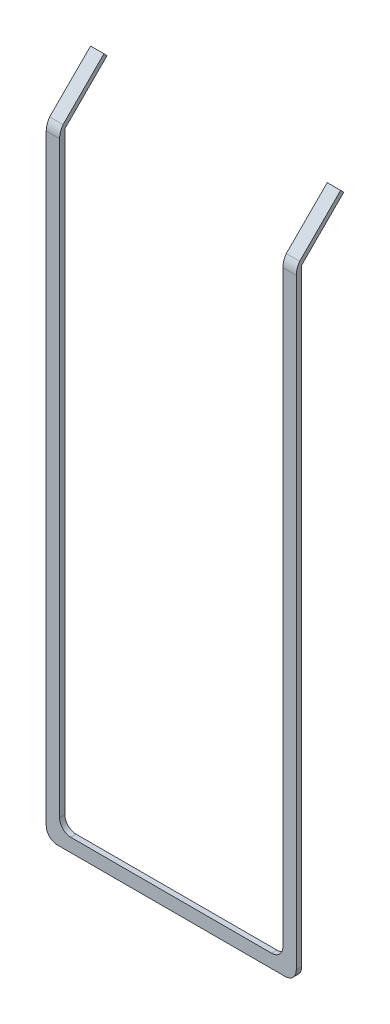
ISO-10303-21;
HEADER;
FILE_DESCRIPTION(('STEP AP214'),'2;1');
FILE_NAME('part.step','',(''),(''),'','','');
FILE_SCHEMA(('AUTOMOTIVE_DESIGN { 1 0 10303 214 1 1 1 1 }'));
ENDSEC;
DATA;
#1=APPLICATION_CONTEXT('core data for automotive mechanical design processes');
#2=APPLICATION_PROTOCOL_DEFINITION('international standard','automotive_design',2000,#1);
#3=PRODUCT_CONTEXT('',#1,'mechanical');
#4=PRODUCT('Part','Part','',(#3));
#5=PRODUCT_RELATED_PRODUCT_CATEGORY('part','',(#4));
#6=PRODUCT_DEFINITION_FORMATION('','',#4);
#7=PRODUCT_DEFINITION_CONTEXT('part definition',#1,'design');
#8=PRODUCT_DEFINITION('design','',#6,#7);
#9=PRODUCT_DEFINITION_SHAPE('','',#8);
#10=(LENGTH_UNIT() NAMED_UNIT(*) SI_UNIT(.MILLI.,.METRE.));
#11=(NAMED_UNIT(*) PLANE_ANGLE_UNIT() SI_UNIT($,.RADIAN.));
#12=(NAMED_UNIT(*) SI_UNIT($,.STERADIAN.) SOLID_ANGLE_UNIT());
#13=UNCERTAINTY_MEASURE_WITH_UNIT(LENGTH_MEASURE(1.E-05),#10,'distance_accuracy_value','');
#14=(GEOMETRIC_REPRESENTATION_CONTEXT(3) GLOBAL_UNCERTAINTY_ASSIGNED_CONTEXT((#13)) GLOBAL_UNIT_ASSIGNED_CONTEXT((#10,
#11,#12)) REPRESENTATION_CONTEXT('',''));
#15=CARTESIAN_POINT('',(0.,0.,0.));
#16=DIRECTION('',(0.,0.,1.));
#17=DIRECTION('',(1.,0.,0.));
#18=AXIS2_PLACEMENT_3D('',#15,#16,#17);
#19=CARTESIAN_POINT('',(-255.,-1375.,-52.5496011966032));
#20=DIRECTION('',(0.,0.,1.));
#21=DIRECTION('',(1.,0.,0.));
#22=AXIS2_PLACEMENT_3D('',#19,#20,#21);
#23=PLANE('',#22);
#24=DIRECTION('',(-1.,0.,0.));
#25=VECTOR('',#24,1.);
#26=CARTESIAN_POINT('',(-255.,-13.9779436067964,-52.5496011966032));
#27=LINE('',#26,#25);
#28=CARTESIAN_POINT('',(-250.,-13.9779436067966,-52.5496011966032));
#29=VERTEX_POINT('',#28);
#30=CARTESIAN_POINT('',(-280.,-13.9779436067966,-52.5496011966032));
#31=VERTEX_POINT('',#30);
#32=EDGE_CURVE('E194',#29,#31,#27,.T.);
#33=ORIENTED_EDGE('',*,*,#32,.F.);
#34=DIRECTION('',(0.,1.,0.));
#35=VECTOR('',#34,1.);
#36=CARTESIAN_POINT('',(-250.,-4.14213562373035,-52.5496011966032));
#37=LINE('',#36,#35);
#38=CARTESIAN_POINT('',(-250.,-1345.,-52.5496011966032));
#39=VERTEX_POINT('',#38);
#40=EDGE_CURVE('E168',#39,#29,#37,.T.);
#41=ORIENTED_EDGE('',*,*,#40,.F.);
#42=CARTESIAN_POINT('',(-225.,-1345.,-52.5496011966032));
#43=DIRECTION('',(0.,0.,-1.));
#44=DIRECTION('',(-1.,0.,0.));
#45=AXIS2_PLACEMENT_3D('',#42,#43,#44);
#46=CIRCLE('',#45,24.9999999999998);
#47=CARTESIAN_POINT('',(-225.,-1370.,-52.5496011966032));
#48=VERTEX_POINT('',#47);
#49=EDGE_CURVE('E259',#48,#39,#46,.T.);
#50=ORIENTED_EDGE('',*,*,#49,.F.);
#51=DIRECTION('',(-1.,0.,0.));
#52=VECTOR('',#51,1.);
#53=CARTESIAN_POINT('',(-225.,-1370.,-52.5496011966032));
#54=LINE('',#53,#52);
#55=CARTESIAN_POINT('',(225.,-1370.,-52.5496011966032));
#56=VERTEX_POINT('',#55);
#57=EDGE_CURVE('E257',#56,#48,#54,.T.);
#58=ORIENTED_EDGE('',*,*,#57,.F.);
#59=CARTESIAN_POINT('',(225.,-1345.,-52.5496011966032));
#60=DIRECTION('',(0.,0.,-1.));
#61=DIRECTION('',(1.,0.,0.));
#62=AXIS2_PLACEMENT_3D('',#59,#60,#61);
#63=CIRCLE('',#62,25.);
#64=CARTESIAN_POINT('',(250.,-1345.,-52.5496011966032));
#65=VERTEX_POINT('',#64);
#66=EDGE_CURVE('E255',#65,#56,#63,.T.);
#67=ORIENTED_EDGE('',*,*,#66,.F.);
#68=DIRECTION('',(0.,-1.,0.));
#69=VECTOR('',#68,1.);
#70=CARTESIAN_POINT('',(250.,-4.14213562373022,-52.5496011966032));
#71=LINE('',#70,#69);
#72=CARTESIAN_POINT('',(250.,-13.9779436067966,-52.5496011966033));
#73=VERTEX_POINT('',#72);
#74=EDGE_CURVE('E253',#73,#65,#71,.T.);
#75=ORIENTED_EDGE('',*,*,#74,.F.);
#76=DIRECTION('',(-1.,0.,0.));
#77=VECTOR('',#76,1.);
#78=CARTESIAN_POINT('',(-255.,-13.9779436067964,-52.5496011966032));
#79=LINE('',#78,#77);
#80=CARTESIAN_POINT('',(280.,-13.9779436067965,-52.5496011966032));
#81=VERTEX_POINT('',#80);
#82=EDGE_CURVE('E284',#81,#73,#79,.T.);
#83=ORIENTED_EDGE('',*,*,#82,.F.);
#84=DIRECTION('',(0.,1.,0.));
#85=VECTOR('',#84,1.);
#86=CARTESIAN_POINT('',(280.,-4.14213562373021,-52.5496011966032));
#87=LINE('',#86,#85);
#88=CARTESIAN_POINT('',(280.,-1375.,-52.5496011966032));
#89=VERTEX_POINT('',#88);
#90=EDGE_CURVE('E250',#89,#81,#87,.T.);
#91=ORIENTED_EDGE('',*,*,#90,.F.);
#92=CARTESIAN_POINT('',(255.,-1375.,-52.5496011966032));
#93=DIRECTION('',(0.,0.,1.));
#94=DIRECTION('',(1.,0.,0.));
#95=AXIS2_PLACEMENT_3D('',#92,#93,#94);
#96=CIRCLE('',#95,24.9999999999999);
#97=CARTESIAN_POINT('',(255.,-1400.,-52.5496011966032));
#98=VERTEX_POINT('',#97);
#99=EDGE_CURVE('E248',#98,#89,#96,.T.);
#100=ORIENTED_EDGE('',*,*,#99,.F.);
#101=DIRECTION('',(1.,0.,0.));
#102=VECTOR('',#101,1.);
#103=CARTESIAN_POINT('',(-255.,-1400.,-52.5496011966032));
#104=LINE('',#103,#102);
#105=CARTESIAN_POINT('',(-255.,-1400.,-52.5496011966032));
#106=VERTEX_POINT('',#105);
#107=EDGE_CURVE('E246',#106,#98,#104,.T.);
#108=ORIENTED_EDGE('',*,*,#107,.F.);
#109=CARTESIAN_POINT('',(-255.,-1375.,-52.5496011966032));
#110=DIRECTION('',(0.,0.,1.));
#111=DIRECTION('',(1.,0.,0.));
#112=AXIS2_PLACEMENT_3D('',#109,#110,#111);
#113=CIRCLE('',#112,25.);
#114=CARTESIAN_POINT('',(-280.,-1375.,-52.5496011966032));
#115=VERTEX_POINT('',#114);
#116=EDGE_CURVE('E244',#115,#106,#113,.T.);
#117=ORIENTED_EDGE('',*,*,#116,.F.);
#118=DIRECTION('',(0.,-1.,0.));
#119=VECTOR('',#118,1.);
#120=CARTESIAN_POINT('',(-280.,-4.14213562373036,-52.5496011966032));
#121=LINE('',#120,#119);
#122=EDGE_CURVE('E220',#31,#115,#121,.T.);
#123=ORIENTED_EDGE('',*,*,#122,.F.);
#124=EDGE_LOOP('',(#33,#41,#50,#58,#67,#75,#83,#91,#100,#108,#117,#123));
#125=FACE_BOUND('',#124,.T.);
#126=ADVANCED_FACE('F36',(#125),#23,.F.);
#127=CARTESIAN_POINT('',(-280.,-4.14213562373036,-40.5496011966032));
#128=DIRECTION('',(1.,0.,0.));
#129=DIRECTION('',(0.,1.,0.));
#130=AXIS2_PLACEMENT_3D('',#127,#128,#129);
#131=PLANE('',#130);
#132=DIRECTION('',(0.,-1.,0.));
#133=VECTOR('',#132,1.);
#134=CARTESIAN_POINT('',(-280.,-4.14213562373036,-40.5496011966032));
#135=LINE('',#134,#133);
#136=CARTESIAN_POINT('',(-280.,-27.7281737474599,-40.5496011966032));
#137=VERTEX_POINT('',#136);
#138=CARTESIAN_POINT('',(-280.,-1375.,-40.5496011966032));
#139=VERTEX_POINT('',#138);
#140=EDGE_CURVE('E221',#137,#139,#135,.T.);
#141=ORIENTED_EDGE('',*,*,#140,.F.);
#142=CARTESIAN_POINT('',(-280.,-27.7281737474599,-80.5496011966032));
#143=DIRECTION('',(1.,0.,0.));
#144=DIRECTION('',(0.,1.,0.));
#145=AXIS2_PLACEMENT_3D('',#142,#143,#144);
#146=CIRCLE('',#145,40.);
#147=CARTESIAN_POINT('',(-280.,-4.14213562373036,-48.2432735559385));
#148=VERTEX_POINT('',#147);
#149=EDGE_CURVE('E44',#137,#148,#146,.F.);
#150=ORIENTED_EDGE('',*,*,#149,.T.);
#151=DIRECTION('',(0.,0.707106781186547,-0.707106781186548));
#152=VECTOR('',#151,1.);
#153=CARTESIAN_POINT('',(-280.,-26.1927045898344,-26.1927045898344));
#154=LINE('',#153,#152);
#155=CARTESIAN_POINT('',(-280.,87.4704436567859,-139.855852836455));
#156=VERTEX_POINT('',#155);
#157=EDGE_CURVE('E173',#148,#156,#154,.T.);
#158=ORIENTED_EDGE('',*,*,#157,.T.);
#159=DIRECTION('',(0.,0.707106781186548,0.707106781186547));
#160=VECTOR('',#159,1.);
#161=CARTESIAN_POINT('',(-280.,80.3993758449205,-146.92692064832));
#162=LINE('',#161,#160);
#163=CARTESIAN_POINT('',(-280.,80.3993758449205,-146.92692064832));
#164=VERTEX_POINT('',#163);
#165=EDGE_CURVE('E181',#164,#156,#162,.T.);
#166=ORIENTED_EDGE('',*,*,#165,.F.);
#167=DIRECTION('',(0.,0.707106781186547,-0.707106781186548));
#168=VECTOR('',#167,1.);
#169=CARTESIAN_POINT('',(-280.,-33.2637724016999,-33.2637724016999));
#170=LINE('',#169,#168);
#171=EDGE_CURVE('E182',#31,#164,#170,.T.);
#172=ORIENTED_EDGE('',*,*,#171,.F.);
#173=ORIENTED_EDGE('',*,*,#122,.T.);
#174=DIRECTION('',(0.,0.,-1.));
#175=VECTOR('',#174,1.);
#176=CARTESIAN_POINT('',(-280.,-1375.,-40.5496011966032));
#177=LINE('',#176,#175);
#178=EDGE_CURVE('E281',#139,#115,#177,.T.);
#179=ORIENTED_EDGE('',*,*,#178,.F.);
#180=EDGE_LOOP('',(#141,#150,#158,#166,#172,#173,#179));
#181=FACE_BOUND('',#180,.T.);
#182=ADVANCED_FACE('F300',(#181),#131,.F.);
#183=CARTESIAN_POINT('',(-255.,-1375.,-40.5496011966032));
#184=DIRECTION('',(0.,0.,-1.));
#185=DIRECTION('',(-1.,0.,0.));
#186=AXIS2_PLACEMENT_3D('',#183,#184,#185);
#187=CYLINDRICAL_SURFACE('',#186,25.);
#188=ORIENTED_EDGE('',*,*,#116,.T.);
#189=DIRECTION('',(0.,0.,-1.));
#190=VECTOR('',#189,1.);
#191=CARTESIAN_POINT('',(-255.,-1400.,-40.5496011966032));
#192=LINE('',#191,#190);
#193=CARTESIAN_POINT('',(-255.,-1400.,-40.5496011966032));
#194=VERTEX_POINT('',#193);
#195=EDGE_CURVE('E278',#194,#106,#192,.T.);
#196=ORIENTED_EDGE('',*,*,#195,.F.);
#197=CARTESIAN_POINT('',(-255.,-1375.,-40.5496011966032));
#198=DIRECTION('',(0.,0.,1.));
#199=DIRECTION('',(1.,0.,0.));
#200=AXIS2_PLACEMENT_3D('',#197,#198,#199);
#201=CIRCLE('',#200,25.);
#202=EDGE_CURVE('E223',#139,#194,#201,.T.);
#203=ORIENTED_EDGE('',*,*,#202,.F.);
#204=ORIENTED_EDGE('',*,*,#178,.T.);
#205=EDGE_LOOP('',(#188,#196,#203,#204));
#206=FACE_BOUND('',#205,.T.);
#207=ADVANCED_FACE('F321',(#206),#187,.T.);
#208=CARTESIAN_POINT('',(-255.,-1400.,-40.5496011966032));
#209=DIRECTION('',(0.,1.,0.));
#210=DIRECTION('',(-1.,0.,0.));
#211=AXIS2_PLACEMENT_3D('',#208,#209,#210);
#212=PLANE('',#211);
#213=ORIENTED_EDGE('',*,*,#107,.T.);
#214=DIRECTION('',(0.,0.,-1.));
#215=VECTOR('',#214,1.);
#216=CARTESIAN_POINT('',(255.,-1400.,-40.5496011966032));
#217=LINE('',#216,#215);
#218=CARTESIAN_POINT('',(255.,-1400.,-40.5496011966032));
#219=VERTEX_POINT('',#218);
#220=EDGE_CURVE('E275',#219,#98,#217,.T.);
#221=ORIENTED_EDGE('',*,*,#220,.F.);
#222=DIRECTION('',(1.,0.,0.));
#223=VECTOR('',#222,1.);
#224=CARTESIAN_POINT('',(-255.,-1400.,-40.5496011966032));
#225=LINE('',#224,#223);
#226=EDGE_CURVE('E225',#194,#219,#225,.T.);
#227=ORIENTED_EDGE('',*,*,#226,.F.);
#228=ORIENTED_EDGE('',*,*,#195,.T.);
#229=EDGE_LOOP('',(#213,#221,#227,#228));
#230=FACE_BOUND('',#229,.T.);
#231=ADVANCED_FACE('F327',(#230),#212,.F.);
#232=CARTESIAN_POINT('',(255.,-1375.,-40.5496011966032));
#233=DIRECTION('',(0.,0.,-1.));
#234=DIRECTION('',(-1.,0.,0.));
#235=AXIS2_PLACEMENT_3D('',#232,#233,#234);
#236=CYLINDRICAL_SURFACE('',#235,24.9999999999999);
#237=ORIENTED_EDGE('',*,*,#99,.T.);
#238=DIRECTION('',(0.,0.,-1.));
#239=VECTOR('',#238,1.);
#240=CARTESIAN_POINT('',(280.,-1375.,-40.5496011966032));
#241=LINE('',#240,#239);
#242=CARTESIAN_POINT('',(280.,-1375.,-40.5496011966032));
#243=VERTEX_POINT('',#242);
#244=EDGE_CURVE('E272',#243,#89,#241,.T.);
#245=ORIENTED_EDGE('',*,*,#244,.F.);
#246=CARTESIAN_POINT('',(255.,-1375.,-40.5496011966032));
#247=DIRECTION('',(0.,0.,1.));
#248=DIRECTION('',(1.,0.,0.));
#249=AXIS2_PLACEMENT_3D('',#246,#247,#248);
#250=CIRCLE('',#249,24.9999999999999);
#251=EDGE_CURVE('E227',#219,#243,#250,.T.);
#252=ORIENTED_EDGE('',*,*,#251,.F.);
#253=ORIENTED_EDGE('',*,*,#220,.T.);
#254=EDGE_LOOP('',(#237,#245,#252,#253));
#255=FACE_BOUND('',#254,.T.);
#256=ADVANCED_FACE('F329',(#255),#236,.T.);
#257=CARTESIAN_POINT('',(280.,-4.14213562373021,-40.5496011966032));
#258=DIRECTION('',(-1.,0.,0.));
#259=DIRECTION('',(0.,-1.,0.));
#260=AXIS2_PLACEMENT_3D('',#257,#258,#259);
#261=PLANE('',#260);
#262=DIRECTION('',(0.,-0.707106781186547,0.707106781186548));
#263=VECTOR('',#262,1.);
#264=CARTESIAN_POINT('',(280.,-26.1927045898345,-26.1927045898345));
#265=LINE('',#264,#263);
#266=CARTESIAN_POINT('',(280.,87.4704436567858,-139.855852836455));
#267=VERTEX_POINT('',#266);
#268=CARTESIAN_POINT('',(280.,-4.14213562373021,-48.2432735559388));
#269=VERTEX_POINT('',#268);
#270=EDGE_CURVE('E197',#267,#269,#265,.T.);
#271=ORIENTED_EDGE('',*,*,#270,.T.);
#272=CARTESIAN_POINT('',(280.,-27.7281737474602,-80.5496011966032));
#273=DIRECTION('',(-1.,0.,0.));
#274=DIRECTION('',(0.,-1.,0.));
#275=AXIS2_PLACEMENT_3D('',#272,#273,#274);
#276=CIRCLE('',#275,40.);
#277=CARTESIAN_POINT('',(280.,-27.7281737474602,-40.5496011966032));
#278=VERTEX_POINT('',#277);
#279=EDGE_CURVE('E296',#269,#278,#276,.F.);
#280=ORIENTED_EDGE('',*,*,#279,.T.);
#281=DIRECTION('',(0.,1.,0.));
#282=VECTOR('',#281,1.);
#283=CARTESIAN_POINT('',(280.,-4.14213562373021,-40.5496011966032));
#284=LINE('',#283,#282);
#285=EDGE_CURVE('E229',#243,#278,#284,.T.);
#286=ORIENTED_EDGE('',*,*,#285,.F.);
#287=ORIENTED_EDGE('',*,*,#244,.T.);
#288=ORIENTED_EDGE('',*,*,#90,.T.);
#289=DIRECTION('',(0.,-0.707106781186547,0.707106781186548));
#290=VECTOR('',#289,1.);
#291=CARTESIAN_POINT('',(280.,-33.2637724017,-33.2637724017));
#292=LINE('',#291,#290);
#293=CARTESIAN_POINT('',(280.,80.3993758449203,-146.92692064832));
#294=VERTEX_POINT('',#293);
#295=EDGE_CURVE('E198',#294,#81,#292,.T.);
#296=ORIENTED_EDGE('',*,*,#295,.F.);
#297=DIRECTION('',(0.,0.707106781186548,0.707106781186547));
#298=VECTOR('',#297,1.);
#299=CARTESIAN_POINT('',(280.,80.3993758449203,-146.92692064832));
#300=LINE('',#299,#298);
#301=EDGE_CURVE('E207',#294,#267,#300,.T.);
#302=ORIENTED_EDGE('',*,*,#301,.T.);
#303=EDGE_LOOP('',(#271,#280,#286,#287,#288,#296,#302));
#304=FACE_BOUND('',#303,.T.);
#305=ADVANCED_FACE('F333',(#304),#261,.F.);
#306=CARTESIAN_POINT('',(250.,-4.14213562373022,-40.5496011966032));
#307=DIRECTION('',(1.,0.,0.));
#308=DIRECTION('',(0.,1.,0.));
#309=AXIS2_PLACEMENT_3D('',#306,#307,#308);
#310=PLANE('',#309);
#311=DIRECTION('',(0.,-1.,0.));
#312=VECTOR('',#311,1.);
#313=CARTESIAN_POINT('',(250.,-4.14213562373022,-40.5496011966032));
#314=LINE('',#313,#312);
#315=CARTESIAN_POINT('',(250.,-27.7281737474602,-40.5496011966032));
#316=VERTEX_POINT('',#315);
#317=CARTESIAN_POINT('',(250.,-1345.,-40.5496011966032));
#318=VERTEX_POINT('',#317);
#319=EDGE_CURVE('E232',#316,#318,#314,.T.);
#320=ORIENTED_EDGE('',*,*,#319,.F.);
#321=CARTESIAN_POINT('',(250.,-27.7281737474602,-80.5496011966032));
#322=DIRECTION('',(1.,0.,0.));
#323=DIRECTION('',(0.,1.,0.));
#324=AXIS2_PLACEMENT_3D('',#321,#322,#323);
#325=CIRCLE('',#324,40.);
#326=CARTESIAN_POINT('',(250.,-4.14213562373022,-48.2432735559388));
#327=VERTEX_POINT('',#326);
#328=EDGE_CURVE('E57',#316,#327,#325,.F.);
#329=ORIENTED_EDGE('',*,*,#328,.T.);
#330=DIRECTION('',(0.,-0.707106781186547,0.707106781186548));
#331=VECTOR('',#330,1.);
#332=CARTESIAN_POINT('',(250.,-26.1927045898345,-26.1927045898345));
#333=LINE('',#332,#331);
#334=CARTESIAN_POINT('',(250.,87.4704436567858,-139.855852836455));
#335=VERTEX_POINT('',#334);
#336=EDGE_CURVE('E202',#335,#327,#333,.T.);
#337=ORIENTED_EDGE('',*,*,#336,.F.);
#338=DIRECTION('',(0.,0.707106781186548,0.707106781186547));
#339=VECTOR('',#338,1.);
#340=CARTESIAN_POINT('',(250.,80.3993758449203,-146.92692064832));
#341=LINE('',#340,#339);
#342=CARTESIAN_POINT('',(250.,80.3993758449203,-146.92692064832));
#343=VERTEX_POINT('',#342);
#344=EDGE_CURVE('E214',#343,#335,#341,.T.);
#345=ORIENTED_EDGE('',*,*,#344,.F.);
#346=DIRECTION('',(0.,-0.707106781186547,0.707106781186548));
#347=VECTOR('',#346,1.);
#348=CARTESIAN_POINT('',(250.,-33.2637724017,-33.2637724017));
#349=LINE('',#348,#347);
#350=EDGE_CURVE('E204',#343,#73,#349,.T.);
#351=ORIENTED_EDGE('',*,*,#350,.T.);
#352=ORIENTED_EDGE('',*,*,#74,.T.);
#353=DIRECTION('',(0.,0.,-1.));
#354=VECTOR('',#353,1.);
#355=CARTESIAN_POINT('',(250.,-1345.,-40.5496011966032));
#356=LINE('',#355,#354);
#357=EDGE_CURVE('E269',#318,#65,#356,.T.);
#358=ORIENTED_EDGE('',*,*,#357,.F.);
#359=EDGE_LOOP('',(#320,#329,#337,#345,#351,#352,#358));
#360=FACE_BOUND('',#359,.T.);
#361=ADVANCED_FACE('F349',(#360),#310,.F.);
#362=CARTESIAN_POINT('',(225.,-1345.,-40.5496011966032));
#363=DIRECTION('',(0.,0.,-1.));
#364=DIRECTION('',(-1.,0.,0.));
#365=AXIS2_PLACEMENT_3D('',#362,#363,#364);
#366=CYLINDRICAL_SURFACE('',#365,25.);
#367=ORIENTED_EDGE('',*,*,#66,.T.);
#368=DIRECTION('',(0.,0.,-1.));
#369=VECTOR('',#368,1.);
#370=CARTESIAN_POINT('',(225.,-1370.,-40.5496011966032));
#371=LINE('',#370,#369);
#372=CARTESIAN_POINT('',(225.,-1370.,-40.5496011966032));
#373=VERTEX_POINT('',#372);
#374=EDGE_CURVE('E266',#373,#56,#371,.T.);
#375=ORIENTED_EDGE('',*,*,#374,.F.);
#376=CARTESIAN_POINT('',(225.,-1345.,-40.5496011966032));
#377=DIRECTION('',(0.,0.,-1.));
#378=DIRECTION('',(1.,0.,0.));
#379=AXIS2_PLACEMENT_3D('',#376,#377,#378);
#380=CIRCLE('',#379,25.);
#381=EDGE_CURVE('E234',#318,#373,#380,.T.);
#382=ORIENTED_EDGE('',*,*,#381,.F.);
#383=ORIENTED_EDGE('',*,*,#357,.T.);
#384=EDGE_LOOP('',(#367,#375,#382,#383));
#385=FACE_BOUND('',#384,.T.);
#386=ADVANCED_FACE('F356',(#385),#366,.F.);
#387=CARTESIAN_POINT('',(-225.,-1370.,-40.5496011966032));
#388=DIRECTION('',(0.,-1.,0.));
#389=DIRECTION('',(1.,0.,0.));
#390=AXIS2_PLACEMENT_3D('',#387,#388,#389);
#391=PLANE('',#390);
#392=ORIENTED_EDGE('',*,*,#57,.T.);
#393=DIRECTION('',(0.,0.,-1.));
#394=VECTOR('',#393,1.);
#395=CARTESIAN_POINT('',(-225.,-1370.,-40.5496011966032));
#396=LINE('',#395,#394);
#397=CARTESIAN_POINT('',(-225.,-1370.,-40.5496011966032));
#398=VERTEX_POINT('',#397);
#399=EDGE_CURVE('E263',#398,#48,#396,.T.);
#400=ORIENTED_EDGE('',*,*,#399,.F.);
#401=DIRECTION('',(-1.,0.,0.));
#402=VECTOR('',#401,1.);
#403=CARTESIAN_POINT('',(-225.,-1370.,-40.5496011966032));
#404=LINE('',#403,#402);
#405=EDGE_CURVE('E236',#373,#398,#404,.T.);
#406=ORIENTED_EDGE('',*,*,#405,.F.);
#407=ORIENTED_EDGE('',*,*,#374,.T.);
#408=EDGE_LOOP('',(#392,#400,#406,#407));
#409=FACE_BOUND('',#408,.T.);
#410=ADVANCED_FACE('F359',(#409),#391,.F.);
#411=CARTESIAN_POINT('',(-225.,-1345.,-40.5496011966032));
#412=DIRECTION('',(0.,0.,-1.));
#413=DIRECTION('',(-1.,0.,0.));
#414=AXIS2_PLACEMENT_3D('',#411,#412,#413);
#415=CYLINDRICAL_SURFACE('',#414,24.9999999999998);
#416=ORIENTED_EDGE('',*,*,#49,.T.);
#417=DIRECTION('',(0.,0.,-1.));
#418=VECTOR('',#417,1.);
#419=CARTESIAN_POINT('',(-250.,-1345.,-40.5496011966032));
#420=LINE('',#419,#418);
#421=CARTESIAN_POINT('',(-250.,-1345.,-40.5496011966032));
#422=VERTEX_POINT('',#421);
#423=EDGE_CURVE('E242',#422,#39,#420,.T.);
#424=ORIENTED_EDGE('',*,*,#423,.F.);
#425=CARTESIAN_POINT('',(-225.,-1345.,-40.5496011966032));
#426=DIRECTION('',(0.,0.,-1.));
#427=DIRECTION('',(-1.,0.,0.));
#428=AXIS2_PLACEMENT_3D('',#425,#426,#427);
#429=CIRCLE('',#428,24.9999999999998);
#430=EDGE_CURVE('E238',#398,#422,#429,.T.);
#431=ORIENTED_EDGE('',*,*,#430,.F.);
#432=ORIENTED_EDGE('',*,*,#399,.T.);
#433=EDGE_LOOP('',(#416,#424,#431,#432));
#434=FACE_BOUND('',#433,.T.);
#435=ADVANCED_FACE('F360',(#434),#415,.F.);
#436=CARTESIAN_POINT('',(-250.,-4.14213562373035,-40.5496011966032));
#437=DIRECTION('',(-1.,0.,0.));
#438=DIRECTION('',(0.,-1.,0.));
#439=AXIS2_PLACEMENT_3D('',#436,#437,#438);
#440=PLANE('',#439);
#441=DIRECTION('',(0.,0.707106781186547,-0.707106781186548));
#442=VECTOR('',#441,1.);
#443=CARTESIAN_POINT('',(-250.,-26.1927045898345,-26.1927045898344));
#444=LINE('',#443,#442);
#445=CARTESIAN_POINT('',(-250.,-4.14213562373035,-48.2432735559385));
#446=VERTEX_POINT('',#445);
#447=CARTESIAN_POINT('',(-250.,87.4704436567859,-139.855852836455));
#448=VERTEX_POINT('',#447);
#449=EDGE_CURVE('E190',#446,#448,#444,.T.);
#450=ORIENTED_EDGE('',*,*,#449,.F.);
#451=CARTESIAN_POINT('',(-250.,-27.7281737474599,-80.5496011966033));
#452=DIRECTION('',(-1.,0.,0.));
#453=DIRECTION('',(0.,-1.,0.));
#454=AXIS2_PLACEMENT_3D('',#451,#452,#453);
#455=CIRCLE('',#454,40.);
#456=CARTESIAN_POINT('',(-250.,-27.7281737474599,-40.5496011966032));
#457=VERTEX_POINT('',#456);
#458=EDGE_CURVE('E11',#446,#457,#455,.F.);
#459=ORIENTED_EDGE('',*,*,#458,.T.);
#460=DIRECTION('',(0.,1.,0.));
#461=VECTOR('',#460,1.);
#462=CARTESIAN_POINT('',(-250.,-4.14213562373035,-40.5496011966032));
#463=LINE('',#462,#461);
#464=EDGE_CURVE('E240',#422,#457,#463,.T.);
#465=ORIENTED_EDGE('',*,*,#464,.F.);
#466=ORIENTED_EDGE('',*,*,#423,.T.);
#467=ORIENTED_EDGE('',*,*,#40,.T.);
#468=DIRECTION('',(0.,0.707106781186547,-0.707106781186548));
#469=VECTOR('',#468,1.);
#470=CARTESIAN_POINT('',(-250.,-33.2637724017,-33.2637724016999));
#471=LINE('',#470,#469);
#472=CARTESIAN_POINT('',(-250.,80.3993758449204,-146.92692064832));
#473=VERTEX_POINT('',#472);
#474=EDGE_CURVE('E161',#29,#473,#471,.T.);
#475=ORIENTED_EDGE('',*,*,#474,.T.);
#476=DIRECTION('',(0.,0.707106781186548,0.707106781186547));
#477=VECTOR('',#476,1.);
#478=CARTESIAN_POINT('',(-250.,80.3993758449204,-146.92692064832));
#479=LINE('',#478,#477);
#480=EDGE_CURVE('E164',#473,#448,#479,.T.);
#481=ORIENTED_EDGE('',*,*,#480,.T.);
#482=EDGE_LOOP('',(#450,#459,#465,#466,#467,#475,#481));
#483=FACE_BOUND('',#482,.T.);
#484=ADVANCED_FACE('F163',(#483),#440,.F.);
#485=CARTESIAN_POINT('',(-255.,-1375.,-40.5496011966032));
#486=DIRECTION('',(0.,0.,1.));
#487=DIRECTION('',(1.,0.,0.));
#488=AXIS2_PLACEMENT_3D('',#485,#486,#487);
#489=PLANE('',#488);
#490=ORIENTED_EDGE('',*,*,#285,.T.);
#491=DIRECTION('',(1.,0.,0.));
#492=VECTOR('',#491,1.);
#493=CARTESIAN_POINT('',(250.,-27.7281737474602,-40.5496011966032));
#494=LINE('',#493,#492);
#495=EDGE_CURVE('E293',#278,#316,#494,.F.);
#496=ORIENTED_EDGE('',*,*,#495,.T.);
#497=ORIENTED_EDGE('',*,*,#319,.T.);
#498=ORIENTED_EDGE('',*,*,#381,.T.);
#499=ORIENTED_EDGE('',*,*,#405,.T.);
#500=ORIENTED_EDGE('',*,*,#430,.T.);
#501=ORIENTED_EDGE('',*,*,#464,.T.);
#502=DIRECTION('',(1.,0.,0.));
#503=VECTOR('',#502,1.);
#504=CARTESIAN_POINT('',(-280.,-27.7281737474599,-40.5496011966032));
#505=LINE('',#504,#503);
#506=EDGE_CURVE('E290',#457,#137,#505,.F.);
#507=ORIENTED_EDGE('',*,*,#506,.T.);
#508=ORIENTED_EDGE('',*,*,#140,.T.);
#509=ORIENTED_EDGE('',*,*,#202,.T.);
#510=ORIENTED_EDGE('',*,*,#226,.T.);
#511=ORIENTED_EDGE('',*,*,#251,.T.);
#512=EDGE_LOOP('',(#490,#496,#497,#498,#499,#500,#501,#507,#508,#509,#510,#511));
#513=FACE_BOUND('',#512,.T.);
#514=ADVANCED_FACE('F307',(#513),#489,.T.);
#515=CARTESIAN_POINT('',(0.,-26.1927045898345,-26.1927045898345));
#516=DIRECTION('',(0.,0.707106781186548,0.707106781186547));
#517=DIRECTION('',(0.,-0.707106781186547,0.707106781186548));
#518=AXIS2_PLACEMENT_3D('',#515,#516,#517);
#519=PLANE('',#518);
#520=DIRECTION('',(-1.,0.,0.));
#521=VECTOR('',#520,1.);
#522=CARTESIAN_POINT('',(280.,-4.14213562373021,-48.2432735559388));
#523=LINE('',#522,#521);
#524=EDGE_CURVE('E216',#269,#327,#523,.T.);
#525=ORIENTED_EDGE('',*,*,#524,.F.);
#526=ORIENTED_EDGE('',*,*,#270,.F.);
#527=DIRECTION('',(1.,0.,0.));
#528=VECTOR('',#527,1.);
#529=CARTESIAN_POINT('',(0.,87.4704436567858,-139.855852836455));
#530=LINE('',#529,#528);
#531=EDGE_CURVE('E210',#335,#267,#530,.T.);
#532=ORIENTED_EDGE('',*,*,#531,.F.);
#533=ORIENTED_EDGE('',*,*,#336,.T.);
#534=EDGE_LOOP('',(#525,#526,#532,#533));
#535=FACE_BOUND('',#534,.T.);
#536=ADVANCED_FACE('F339',(#535),#519,.T.);
#537=CARTESIAN_POINT('',(0.,-33.2637724017,-33.2637724016999));
#538=DIRECTION('',(0.,0.707106781186548,0.707106781186547));
#539=DIRECTION('',(0.,-0.707106781186547,0.707106781186548));
#540=AXIS2_PLACEMENT_3D('',#537,#538,#539);
#541=PLANE('',#540);
#542=ORIENTED_EDGE('',*,*,#295,.T.);
#543=ORIENTED_EDGE('',*,*,#82,.T.);
#544=ORIENTED_EDGE('',*,*,#350,.F.);
#545=DIRECTION('',(1.,0.,0.));
#546=VECTOR('',#545,1.);
#547=CARTESIAN_POINT('',(0.,80.3993758449203,-146.92692064832));
#548=LINE('',#547,#546);
#549=EDGE_CURVE('E201',#343,#294,#548,.T.);
#550=ORIENTED_EDGE('',*,*,#549,.T.);
#551=EDGE_LOOP('',(#542,#543,#544,#550));
#552=FACE_BOUND('',#551,.T.);
#553=ADVANCED_FACE('F380',(#552),#541,.F.);
#554=CARTESIAN_POINT('',(0.,80.3993758449203,-146.92692064832));
#555=DIRECTION('',(0.,-0.707106781186547,0.707106781186548));
#556=DIRECTION('',(0.,-0.707106781186548,-0.707106781186547));
#557=AXIS2_PLACEMENT_3D('',#554,#555,#556);
#558=PLANE('',#557);
#559=ORIENTED_EDGE('',*,*,#531,.T.);
#560=ORIENTED_EDGE('',*,*,#301,.F.);
#561=ORIENTED_EDGE('',*,*,#549,.F.);
#562=ORIENTED_EDGE('',*,*,#344,.T.);
#563=EDGE_LOOP('',(#559,#560,#561,#562));
#564=FACE_BOUND('',#563,.T.);
#565=ADVANCED_FACE('F346',(#564),#558,.F.);
#566=CARTESIAN_POINT('',(0.,-33.2637724017,-33.2637724016999));
#567=DIRECTION('',(0.,0.707106781186548,0.707106781186547));
#568=DIRECTION('',(0.,-0.707106781186547,0.707106781186548));
#569=AXIS2_PLACEMENT_3D('',#566,#567,#568);
#570=PLANE('',#569);
#571=ORIENTED_EDGE('',*,*,#474,.F.);
#572=ORIENTED_EDGE('',*,*,#32,.T.);
#573=ORIENTED_EDGE('',*,*,#171,.T.);
#574=DIRECTION('',(-1.,0.,0.));
#575=VECTOR('',#574,1.);
#576=CARTESIAN_POINT('',(0.,80.3993758449204,-146.92692064832));
#577=LINE('',#576,#575);
#578=EDGE_CURVE('E172',#473,#164,#577,.T.);
#579=ORIENTED_EDGE('',*,*,#578,.F.);
#580=EDGE_LOOP('',(#571,#572,#573,#579));
#581=FACE_BOUND('',#580,.T.);
#582=ADVANCED_FACE('F184',(#581),#570,.F.);
#583=CARTESIAN_POINT('',(0.,-26.1927045898345,-26.1927045898345));
#584=DIRECTION('',(0.,0.707106781186548,0.707106781186547));
#585=DIRECTION('',(0.,-0.707106781186547,0.707106781186548));
#586=AXIS2_PLACEMENT_3D('',#583,#584,#585);
#587=PLANE('',#586);
#588=DIRECTION('',(-1.,0.,0.));
#589=VECTOR('',#588,1.);
#590=CARTESIAN_POINT('',(-280.,-4.14213562373036,-48.2432735559385));
#591=LINE('',#590,#589);
#592=EDGE_CURVE('E287',#446,#148,#591,.T.);
#593=ORIENTED_EDGE('',*,*,#592,.F.);
#594=ORIENTED_EDGE('',*,*,#449,.T.);
#595=DIRECTION('',(-1.,0.,0.));
#596=VECTOR('',#595,1.);
#597=CARTESIAN_POINT('',(0.,87.4704436567859,-139.855852836455));
#598=LINE('',#597,#596);
#599=EDGE_CURVE('E180',#448,#156,#598,.T.);
#600=ORIENTED_EDGE('',*,*,#599,.T.);
#601=ORIENTED_EDGE('',*,*,#157,.F.);
#602=EDGE_LOOP('',(#593,#594,#600,#601));
#603=FACE_BOUND('',#602,.T.);
#604=ADVANCED_FACE('F305',(#603),#587,.T.);
#605=CARTESIAN_POINT('',(0.,80.3993758449204,-146.92692064832));
#606=DIRECTION('',(0.,0.707106781186547,-0.707106781186548));
#607=DIRECTION('',(0.,0.707106781186548,0.707106781186547));
#608=AXIS2_PLACEMENT_3D('',#605,#606,#607);
#609=PLANE('',#608);
#610=ORIENTED_EDGE('',*,*,#599,.F.);
#611=ORIENTED_EDGE('',*,*,#480,.F.);
#612=ORIENTED_EDGE('',*,*,#578,.T.);
#613=ORIENTED_EDGE('',*,*,#165,.T.);
#614=EDGE_LOOP('',(#610,#611,#612,#613));
#615=FACE_BOUND('',#614,.T.);
#616=ADVANCED_FACE('F177',(#615),#609,.T.);
#617=CARTESIAN_POINT('',(280.,-27.7281737474602,-80.5496011966032));
#618=DIRECTION('',(-1.,0.,0.));
#619=DIRECTION('',(0.,0.,1.));
#620=AXIS2_PLACEMENT_3D('',#617,#618,#619);
#621=CYLINDRICAL_SURFACE('',#620,40.);
#622=ORIENTED_EDGE('',*,*,#279,.F.);
#623=ORIENTED_EDGE('',*,*,#524,.T.);
#624=ORIENTED_EDGE('',*,*,#328,.F.);
#625=ORIENTED_EDGE('',*,*,#495,.F.);
#626=EDGE_LOOP('',(#622,#623,#624,#625));
#627=FACE_BOUND('',#626,.T.);
#628=ADVANCED_FACE('F336',(#627),#621,.T.);
#629=CARTESIAN_POINT('',(-280.,-27.7281737474599,-80.5496011966032));
#630=DIRECTION('',(-1.,0.,0.));
#631=DIRECTION('',(0.,0.,1.));
#632=AXIS2_PLACEMENT_3D('',#629,#630,#631);
#633=CYLINDRICAL_SURFACE('',#632,40.);
#634=ORIENTED_EDGE('',*,*,#458,.F.);
#635=ORIENTED_EDGE('',*,*,#592,.T.);
#636=ORIENTED_EDGE('',*,*,#149,.F.);
#637=ORIENTED_EDGE('',*,*,#506,.F.);
#638=EDGE_LOOP('',(#634,#635,#636,#637));
#639=FACE_BOUND('',#638,.T.);
#640=ADVANCED_FACE('F38',(#639),#633,.T.);
#641=CLOSED_SHELL('',(#126,#182,#207,#231,#256,#305,#361,#386,#410,#435,#484,#514,#536,#553,
#565,#582,#604,#616,#628,#640));
#642=MANIFOLD_SOLID_BREP('B2',#641);
#643=ADVANCED_BREP_SHAPE_REPRESENTATION('',(#18,#642),#14);
#644=SHAPE_DEFINITION_REPRESENTATION(#9,#643);
ENDSEC;
END-ISO-10303-21;
